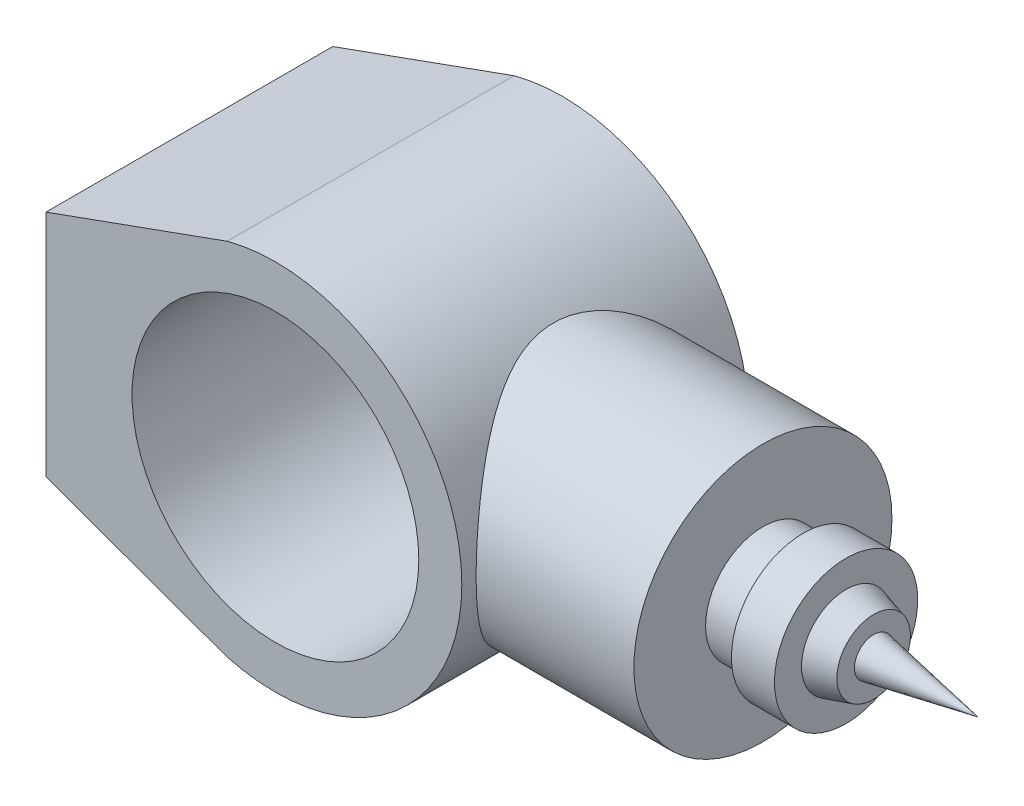
ISO-10303-21;
HEADER;
FILE_DESCRIPTION(('STEP AP214'),'2;1');
FILE_NAME('part.step','',(''),(''),'','','');
FILE_SCHEMA(('AUTOMOTIVE_DESIGN { 1 0 10303 214 1 1 1 1 }'));
ENDSEC;
DATA;
#1=APPLICATION_CONTEXT('core data for automotive mechanical design processes');
#2=APPLICATION_PROTOCOL_DEFINITION('international standard','automotive_design',2000,#1);
#3=PRODUCT_CONTEXT('',#1,'mechanical');
#4=PRODUCT('Part','Part','',(#3));
#5=PRODUCT_RELATED_PRODUCT_CATEGORY('part','',(#4));
#6=PRODUCT_DEFINITION_FORMATION('','',#4);
#7=PRODUCT_DEFINITION_CONTEXT('part definition',#1,'design');
#8=PRODUCT_DEFINITION('design','',#6,#7);
#9=PRODUCT_DEFINITION_SHAPE('','',#8);
#10=(LENGTH_UNIT() NAMED_UNIT(*) SI_UNIT(.MILLI.,.METRE.));
#11=(NAMED_UNIT(*) PLANE_ANGLE_UNIT() SI_UNIT($,.RADIAN.));
#12=(NAMED_UNIT(*) SI_UNIT($,.STERADIAN.) SOLID_ANGLE_UNIT());
#13=UNCERTAINTY_MEASURE_WITH_UNIT(LENGTH_MEASURE(1.E-05),#10,'distance_accuracy_value','');
#14=(GEOMETRIC_REPRESENTATION_CONTEXT(3) GLOBAL_UNCERTAINTY_ASSIGNED_CONTEXT((#13)) GLOBAL_UNIT_ASSIGNED_CONTEXT((#10,
#11,#12)) REPRESENTATION_CONTEXT('',''));
#15=CARTESIAN_POINT('',(0.,0.,0.));
#16=DIRECTION('',(0.,0.,1.));
#17=DIRECTION('',(1.,0.,0.));
#18=AXIS2_PLACEMENT_3D('',#15,#16,#17);
#19=CARTESIAN_POINT('',(0.,0.,50.));
#20=DIRECTION('',(0.,0.,1.));
#21=DIRECTION('',(1.,0.,0.));
#22=AXIS2_PLACEMENT_3D('',#19,#20,#21);
#23=PLANE('',#22);
#24=DIRECTION('',(-0.94071150861508,-0.339207690890317,0.));
#25=VECTOR('',#24,1.);
#26=CARTESIAN_POINT('',(-80.,40.,50.));
#27=LINE('',#26,#25);
#28=CARTESIAN_POINT('',(-16.7748419777573,62.7981263782708,50.));
#29=VERTEX_POINT('',#28);
#30=CARTESIAN_POINT('',(-80.,40.,50.));
#31=VERTEX_POINT('',#30);
#32=EDGE_CURVE('E183',#29,#31,#27,.T.);
#33=ORIENTED_EDGE('',*,*,#32,.T.);
#34=DIRECTION('',(0.,-1.,0.));
#35=VECTOR('',#34,1.);
#36=CARTESIAN_POINT('',(-80.,-40.,50.));
#37=LINE('',#36,#35);
#38=CARTESIAN_POINT('',(-80.,-40.,50.));
#39=VERTEX_POINT('',#38);
#40=EDGE_CURVE('E87',#31,#39,#37,.T.);
#41=ORIENTED_EDGE('',*,*,#40,.T.);
#42=DIRECTION('',(0.94071150861508,-0.339207690890317,0.));
#43=VECTOR('',#42,1.);
#44=CARTESIAN_POINT('',(-80.,-40.,50.));
#45=LINE('',#44,#43);
#46=CARTESIAN_POINT('',(-16.7748419777573,-62.7981263782708,50.));
#47=VERTEX_POINT('',#46);
#48=EDGE_CURVE('E182',#39,#47,#45,.T.);
#49=ORIENTED_EDGE('',*,*,#48,.T.);
#50=CARTESIAN_POINT('',(0.,0.,50.));
#51=DIRECTION('',(0.,0.,1.));
#52=DIRECTION('',(1.,0.,0.));
#53=AXIS2_PLACEMENT_3D('',#50,#51,#52);
#54=CIRCLE('',#53,65.);
#55=EDGE_CURVE('E57',#47,#29,#54,.T.);
#56=ORIENTED_EDGE('',*,*,#55,.T.);
#57=EDGE_LOOP('',(#33,#41,#49,#56));
#58=FACE_BOUND('',#57,.T.);
#59=CARTESIAN_POINT('',(0.,0.,50.));
#60=DIRECTION('',(0.,0.,1.));
#61=DIRECTION('',(1.,0.,0.));
#62=AXIS2_PLACEMENT_3D('',#59,#60,#61);
#63=CIRCLE('',#62,50.);
#64=CARTESIAN_POINT('',(50.,0.,50.));
#65=VERTEX_POINT('',#64);
#66=EDGE_CURVE('E193',#65,#65,#63,.T.);
#67=ORIENTED_EDGE('',*,*,#66,.F.);
#68=EDGE_LOOP('',(#67));
#69=FACE_BOUND('',#68,.T.);
#70=ADVANCED_FACE('F39',(#58,#69),#23,.T.);
#71=CARTESIAN_POINT('',(0.,0.,-50.));
#72=DIRECTION('',(0.,0.,1.));
#73=DIRECTION('',(1.,0.,0.));
#74=AXIS2_PLACEMENT_3D('',#71,#72,#73);
#75=PLANE('',#74);
#76=DIRECTION('',(-0.94071150861508,-0.339207690890317,0.));
#77=VECTOR('',#76,1.);
#78=CARTESIAN_POINT('',(-80.,40.,-50.));
#79=LINE('',#78,#77);
#80=CARTESIAN_POINT('',(-16.7748419777573,62.7981263782708,-50.));
#81=VERTEX_POINT('',#80);
#82=CARTESIAN_POINT('',(-80.,40.,-50.));
#83=VERTEX_POINT('',#82);
#84=EDGE_CURVE('E176',#81,#83,#79,.T.);
#85=ORIENTED_EDGE('',*,*,#84,.F.);
#86=CARTESIAN_POINT('',(0.,0.,-50.));
#87=DIRECTION('',(0.,0.,1.));
#88=DIRECTION('',(1.,0.,0.));
#89=AXIS2_PLACEMENT_3D('',#86,#87,#88);
#90=CIRCLE('',#89,65.);
#91=CARTESIAN_POINT('',(-16.7748419777573,-62.7981263782708,-50.));
#92=VERTEX_POINT('',#91);
#93=EDGE_CURVE('E78',#92,#81,#90,.T.);
#94=ORIENTED_EDGE('',*,*,#93,.F.);
#95=DIRECTION('',(0.94071150861508,-0.339207690890317,0.));
#96=VECTOR('',#95,1.);
#97=CARTESIAN_POINT('',(-80.,-40.,-50.));
#98=LINE('',#97,#96);
#99=CARTESIAN_POINT('',(-80.,-40.,-50.));
#100=VERTEX_POINT('',#99);
#101=EDGE_CURVE('E74',#100,#92,#98,.T.);
#102=ORIENTED_EDGE('',*,*,#101,.F.);
#103=DIRECTION('',(0.,-1.,0.));
#104=VECTOR('',#103,1.);
#105=CARTESIAN_POINT('',(-80.,-40.,-50.));
#106=LINE('',#105,#104);
#107=EDGE_CURVE('E171',#83,#100,#106,.T.);
#108=ORIENTED_EDGE('',*,*,#107,.F.);
#109=EDGE_LOOP('',(#85,#94,#102,#108));
#110=FACE_BOUND('',#109,.T.);
#111=CARTESIAN_POINT('',(0.,0.,-50.));
#112=DIRECTION('',(0.,0.,1.));
#113=DIRECTION('',(1.,0.,0.));
#114=AXIS2_PLACEMENT_3D('',#111,#112,#113);
#115=CIRCLE('',#114,50.);
#116=CARTESIAN_POINT('',(50.,0.,-50.));
#117=VERTEX_POINT('',#116);
#118=EDGE_CURVE('E197',#117,#117,#115,.T.);
#119=ORIENTED_EDGE('',*,*,#118,.T.);
#120=EDGE_LOOP('',(#119));
#121=FACE_BOUND('',#120,.T.);
#122=ADVANCED_FACE('F152',(#110,#121),#75,.F.);
#123=CARTESIAN_POINT('',(-80.,40.,50.));
#124=DIRECTION('',(0.339207690890317,-0.94071150861508,0.));
#125=DIRECTION('',(0.94071150861508,0.339207690890317,0.));
#126=AXIS2_PLACEMENT_3D('',#123,#124,#125);
#127=PLANE('',#126);
#128=ORIENTED_EDGE('',*,*,#84,.T.);
#129=DIRECTION('',(0.,0.,-1.));
#130=VECTOR('',#129,1.);
#131=CARTESIAN_POINT('',(-80.,40.,50.));
#132=LINE('',#131,#130);
#133=EDGE_CURVE('E11',#31,#83,#132,.T.);
#134=ORIENTED_EDGE('',*,*,#133,.F.);
#135=ORIENTED_EDGE('',*,*,#32,.F.);
#136=DIRECTION('',(0.,0.,-1.));
#137=VECTOR('',#136,1.);
#138=CARTESIAN_POINT('',(-16.7748419777573,62.7981263782708,50.));
#139=LINE('',#138,#137);
#140=EDGE_CURVE('E186',#29,#81,#139,.T.);
#141=ORIENTED_EDGE('',*,*,#140,.T.);
#142=EDGE_LOOP('',(#128,#134,#135,#141));
#143=FACE_BOUND('',#142,.T.);
#144=ADVANCED_FACE('F41',(#143),#127,.F.);
#145=CARTESIAN_POINT('',(-80.,-40.,50.));
#146=DIRECTION('',(1.,0.,0.));
#147=DIRECTION('',(0.,0.,-1.));
#148=AXIS2_PLACEMENT_3D('',#145,#146,#147);
#149=PLANE('',#148);
#150=ORIENTED_EDGE('',*,*,#107,.T.);
#151=DIRECTION('',(0.,0.,-1.));
#152=VECTOR('',#151,1.);
#153=CARTESIAN_POINT('',(-80.,-40.,50.));
#154=LINE('',#153,#152);
#155=EDGE_CURVE('E48',#39,#100,#154,.T.);
#156=ORIENTED_EDGE('',*,*,#155,.F.);
#157=ORIENTED_EDGE('',*,*,#40,.F.);
#158=ORIENTED_EDGE('',*,*,#133,.T.);
#159=EDGE_LOOP('',(#150,#156,#157,#158));
#160=FACE_BOUND('',#159,.T.);
#161=ADVANCED_FACE('F169',(#160),#149,.F.);
#162=CARTESIAN_POINT('',(-80.,-40.,50.));
#163=DIRECTION('',(0.339207690890317,0.940711508615079,0.));
#164=DIRECTION('',(-0.94071150861508,0.339207690890317,0.));
#165=AXIS2_PLACEMENT_3D('',#162,#163,#164);
#166=PLANE('',#165);
#167=ORIENTED_EDGE('',*,*,#101,.T.);
#168=DIRECTION('',(0.,0.,-1.));
#169=VECTOR('',#168,1.);
#170=CARTESIAN_POINT('',(-16.7748419777573,-62.7981263782708,50.));
#171=LINE('',#170,#169);
#172=EDGE_CURVE('E185',#47,#92,#171,.T.);
#173=ORIENTED_EDGE('',*,*,#172,.F.);
#174=ORIENTED_EDGE('',*,*,#48,.F.);
#175=ORIENTED_EDGE('',*,*,#155,.T.);
#176=EDGE_LOOP('',(#167,#173,#174,#175));
#177=FACE_BOUND('',#176,.T.);
#178=ADVANCED_FACE('F164',(#177),#166,.F.);
#179=CARTESIAN_POINT('',(0.,0.,50.));
#180=DIRECTION('',(0.,0.,-1.));
#181=DIRECTION('',(-1.,0.,0.));
#182=AXIS2_PLACEMENT_3D('',#179,#180,#181);
#183=CYLINDRICAL_SURFACE('',#182,65.);
#184=CARTESIAN_POINT('',(65.,0.,-45.));
#185=CARTESIAN_POINT('',(65.0000011696057,1.12147330120565,-45.0000012025283));
#186=CARTESIAN_POINT('',(64.9709159765212,2.24292945230778,-44.9580201602482));
#187=CARTESIAN_POINT('',(64.8553068641383,4.47658414079082,-44.790785609369));
#188=CARTESIAN_POINT('',(64.7687842573088,5.58878288911931,-44.6655340035371));
#189=CARTESIAN_POINT('',(64.5403785763001,7.79555151848628,-44.3336771879691));
#190=CARTESIAN_POINT('',(64.3984760503456,8.89011506447751,-44.1270433931238));
#191=CARTESIAN_POINT('',(64.0626457436966,11.0533096019768,-43.6354760134034));
#192=CARTESIAN_POINT('',(63.8687169569864,12.1219400915896,-43.3505409144375));
#193=CARTESIAN_POINT('',(63.4342222744662,14.2212125160505,-42.7078017297046));
#194=CARTESIAN_POINT('',(63.1938918545645,15.2520162370063,-42.3503651251477));
#195=CARTESIAN_POINT('',(62.6709259446924,17.2756280115286,-41.5659763086892));
#196=CARTESIAN_POINT('',(62.3882907364915,18.268436318107,-41.1390245597888));
#197=CARTESIAN_POINT('',(61.786108553932,20.2116697228795,-40.2199419970838));
#198=CARTESIAN_POINT('',(61.4665619062631,21.1620951960855,-39.7278117601444));
#199=CARTESIAN_POINT('',(60.7962171584065,23.0172309124314,-38.6825647509799));
#200=CARTESIAN_POINT('',(60.4454175300334,23.9219389167185,-38.1294449962195));
#201=CARTESIAN_POINT('',(59.6865648974474,25.7601880140228,-36.9151737617935));
#202=CARTESIAN_POINT('',(59.27618815402,26.6893215363404,-36.2488040005491));
#203=CARTESIAN_POINT('',(58.4330275057249,28.4880338622967,-34.8529502059224));
#204=CARTESIAN_POINT('',(58.0002425478181,29.3576098626539,-34.1234632053608));
#205=CARTESIAN_POINT('',(57.1195111836477,31.0364486388513,-32.6040251352403));
#206=CARTESIAN_POINT('',(56.6715447181891,31.8456267033451,-31.8139921794123));
#207=CARTESIAN_POINT('',(55.7691986061138,33.4006700551814,-30.1773036556993));
#208=CARTESIAN_POINT('',(55.3148185876119,34.1465316534289,-29.3306447936721));
#209=CARTESIAN_POINT('',(54.3303114345595,35.6959084068904,-27.4326466159468));
#210=CARTESIAN_POINT('',(53.8005937511269,36.4872853280241,-26.3711450656527));
#211=CARTESIAN_POINT('',(52.7593327891933,37.9773509509911,-24.17604025639));
#212=CARTESIAN_POINT('',(52.2477941160227,38.6760162868262,-23.0424189272517));
#213=CARTESIAN_POINT('',(51.2608149265043,39.9749077721744,-20.7072341856928));
#214=CARTESIAN_POINT('',(50.7853275075273,40.5752630453964,-19.5057627267967));
#215=CARTESIAN_POINT('',(49.8892399163793,41.6721166930025,-17.036931864064));
#216=CARTESIAN_POINT('',(49.4686114171658,42.1686687478853,-15.7696069409943));
#217=CARTESIAN_POINT('',(48.8208029416879,42.9149535309565,-13.5723996352816));
#218=CARTESIAN_POINT('',(48.5738420263557,43.1936925213245,-12.6581208440976));
#219=CARTESIAN_POINT('',(48.1238801744123,43.6944569649788,-10.8035389223551));
#220=CARTESIAN_POINT('',(47.9208721021929,43.9164916250901,-9.86324004407419));
#221=CARTESIAN_POINT('',(47.5660754926548,44.3005296261305,-7.96250438663409));
#222=CARTESIAN_POINT('',(47.4142038087044,44.4626304606427,-7.00210302149487));
#223=CARTESIAN_POINT('',(47.1671263845177,44.7246555122386,-5.06554052628518));
#224=CARTESIAN_POINT('',(47.0719206259529,44.824579749433,-4.08937940131224));
#225=CARTESIAN_POINT('',(46.9418899090943,44.9607388198673,-2.1232364847967));
#226=CARTESIAN_POINT('',(46.9073939345417,44.9966266570423,-1.13320851844658));
#227=CARTESIAN_POINT('',(46.9013571135476,45.0029190462422,0.847248377093852));
#228=CARTESIAN_POINT('',(46.9298161498631,44.9733237202183,1.837677305534));
#229=CARTESIAN_POINT('',(47.0484302849821,44.8492190899201,3.81128752429081));
#230=CARTESIAN_POINT('',(47.13862305521,44.7546701492421,4.79446401850661));
#231=CARTESIAN_POINT('',(47.3768313176079,44.5024241630868,6.74551496467455));
#232=CARTESIAN_POINT('',(47.5248480621437,44.3447257499009,7.71338908473168));
#233=CARTESIAN_POINT('',(47.8621764271841,43.9803320764262,9.56919366964684));
#234=CARTESIAN_POINT('',(48.0484149088864,43.7772163066585,10.4583970625519));
#235=CARTESIAN_POINT('',(48.4609441046406,43.32010640119,12.2144143492181));
#236=CARTESIAN_POINT('',(48.6872496045115,43.0660934784815,13.0812198417583));
#237=CARTESIAN_POINT('',(49.1738509640383,42.5096331932465,14.7898225666927));
#238=CARTESIAN_POINT('',(49.4341648638834,42.2071601049958,15.6316062329481));
#239=CARTESIAN_POINT('',(49.9825182796335,41.5563350032134,17.2876417419013));
#240=CARTESIAN_POINT('',(50.2705534011697,41.2079902580444,18.1018979206949));
#241=CARTESIAN_POINT('',(51.0225431471345,40.2767822129268,20.1137766396802));
#242=CARTESIAN_POINT('',(51.5007434523328,39.6654891440572,21.2930273345177));
#243=CARTESIAN_POINT('',(52.4891158781477,38.348029920852,23.5833678403921));
#244=CARTESIAN_POINT('',(52.9993005340589,37.6418264436726,24.6944305853524));
#245=CARTESIAN_POINT('',(54.0361557973494,36.1376496350166,26.8476775780095));
#246=CARTESIAN_POINT('',(54.5628535785461,35.3395185623559,27.8897384505711));
#247=CARTESIAN_POINT('',(55.6171804467178,33.6558443419671,29.8998791095632));
#248=CARTESIAN_POINT('',(56.1448094104418,32.7703120184234,30.8679680307498));
#249=CARTESIAN_POINT('',(57.1932449701135,30.9045304086319,32.7363921475659));
#250=CARTESIAN_POINT('',(57.7139191350983,29.9233731295192,33.6358963165067));
#251=CARTESIAN_POINT('',(58.7296419536465,27.8771206485979,35.350355349792));
#252=CARTESIAN_POINT('',(59.2246882700661,26.8120178135979,36.1653025097018));
#253=CARTESIAN_POINT('',(60.1756566955639,24.6035209522421,37.7024332048813));
#254=CARTESIAN_POINT('',(60.6316475651595,23.4602711709794,38.4247809320632));
#255=CARTESIAN_POINT('',(61.4931891608211,21.0989507187335,39.7703323765769));
#256=CARTESIAN_POINT('',(61.898755017873,19.8809026570889,40.3935658507715));
#257=CARTESIAN_POINT('',(62.5646802947783,17.6549035875762,41.4059204565395));
#258=CARTESIAN_POINT('',(62.8372982548467,16.6602403417733,41.8163120535009));
#259=CARTESIAN_POINT('',(63.3397164077328,14.6345031625144,42.5675669112335));
#260=CARTESIAN_POINT('',(63.569522535998,13.603434299959,42.9084398107234));
#261=CARTESIAN_POINT('',(63.9815049902596,11.5110112910016,43.5164676119118));
#262=CARTESIAN_POINT('',(64.1637052650743,10.4496726714621,43.7836595836378));
#263=CARTESIAN_POINT('',(64.476639865795,8.30296993183371,44.2409869387356));
#264=CARTESIAN_POINT('',(64.6073730982257,7.21760530180254,44.431120684921));
#265=CARTESIAN_POINT('',(64.8147345736682,5.02649787175023,44.7321113931983));
#266=CARTESIAN_POINT('',(64.8911534961694,3.92069290489763,44.8426616714377));
#267=CARTESIAN_POINT('',(64.9872183357685,1.70145350776208,44.981563734156));
#268=CARTESIAN_POINT('',(65.0068642771874,0.588019080747696,45.0099155538474));
#269=CARTESIAN_POINT('',(64.9889001241945,-1.63741781931566,44.9839662509349));
#270=CARTESIAN_POINT('',(64.9512898349751,-2.74942028747967,44.929664847113));
#271=CARTESIAN_POINT('',(64.819734418053,-4.96298947367603,44.7392747901952));
#272=CARTESIAN_POINT('',(64.7257910494465,-6.06455651648127,44.6031886909653));
#273=CARTESIAN_POINT('',(64.491175703309,-8.18254449212149,44.2620157992034));
#274=CARTESIAN_POINT('',(64.3536808680178,-9.20007959997774,44.0616107864454));
#275=CARTESIAN_POINT('',(64.0337856060908,-11.2121337136589,43.5930613516679));
#276=CARTESIAN_POINT('',(63.8513873855499,-12.2066538475799,43.3249202574929));
#277=CARTESIAN_POINT('',(63.4451725249075,-14.1673074608523,42.7239854011605));
#278=CARTESIAN_POINT('',(63.2213525684632,-15.1334386601223,42.3911864622047));
#279=CARTESIAN_POINT('',(62.736336352677,-17.0327019487273,41.6643868113868));
#280=CARTESIAN_POINT('',(62.4751380044848,-17.965832190203,41.2703826790343));
#281=CARTESIAN_POINT('',(61.8990085085122,-19.8637431772395,40.3931275129008));
#282=CARTESIAN_POINT('',(61.5815209528501,-20.8256806929253,39.9054081529014));
#283=CARTESIAN_POINT('',(60.9142086391395,-22.7035764997345,38.8677076181211));
#284=CARTESIAN_POINT('',(60.5643826081083,-23.6195329786528,38.3177239921568));
#285=CARTESIAN_POINT('',(59.8381347129401,-25.4032558353403,37.1592008079418));
#286=CARTESIAN_POINT('',(59.4616987975441,-26.270996314329,36.5506302507532));
#287=CARTESIAN_POINT('',(58.6884577670336,-27.9557544991496,35.2787474176625));
#288=CARTESIAN_POINT('',(58.2916515549571,-28.7727694681138,34.6154321925309));
#289=CARTESIAN_POINT('',(57.4151711853793,-30.4889708749912,33.1199200847161));
#290=CARTESIAN_POINT('',(56.9328754552547,-31.3785212006928,32.2781812569548));
#291=CARTESIAN_POINT('',(55.9590893109094,-33.0839042215169,30.5278352445589));
#292=CARTESIAN_POINT('',(55.4675975421249,-33.8997259516808,29.6192181500899));
#293=CARTESIAN_POINT('',(54.4860350387397,-35.45586994741,27.7375714933993));
#294=CARTESIAN_POINT('',(53.9959654596117,-36.1961418986443,26.7644997080007));
#295=CARTESIAN_POINT('',(53.0294834997435,-37.5978502361011,24.7568233036382));
#296=CARTESIAN_POINT('',(52.553069328415,-38.2592969946585,23.7222268074148));
#297=CARTESIAN_POINT('',(51.679941347726,-39.4291013564639,21.7149007388747));
#298=CARTESIAN_POINT('',(51.2803372484816,-39.9463152685162,20.7485884228094));
#299=CARTESIAN_POINT('',(50.5123974548912,-40.9130636661729,18.7705314851885));
#300=CARTESIAN_POINT('',(50.1440619804653,-41.3625976757848,17.7587865441704));
#301=CARTESIAN_POINT('',(49.4504928922364,-42.1893301292689,15.693797265063));
#302=CARTESIAN_POINT('',(49.1251906412473,-42.566644202947,14.6406225749502));
#303=CARTESIAN_POINT('',(48.5290098021012,-43.2451098617227,12.4950157035289));
#304=CARTESIAN_POINT('',(48.2581179989952,-43.5462799449171,11.4025931307277));
#305=CARTESIAN_POINT('',(47.8271610412375,-44.0186874861181,9.3921629994351));
#306=CARTESIAN_POINT('',(47.6558419905218,-44.2036946073207,8.47979353570419));
#307=CARTESIAN_POINT('',(47.3627606953031,-44.517583244497,6.63757582668245));
#308=CARTESIAN_POINT('',(47.2409923142224,-44.6464717105955,5.70772976070373));
#309=CARTESIAN_POINT('',(47.05166615705,-44.8459556683364,3.83718735816971));
#310=CARTESIAN_POINT('',(46.9840561376509,-44.9166073394187,2.89650236820514));
#311=CARTESIAN_POINT('',(46.9055698265682,-44.9985645522097,1.01014116515035));
#312=CARTESIAN_POINT('',(46.894694331428,-45.0098692606967,0.0644648821697862));
#313=CARTESIAN_POINT('',(46.9301408777119,-44.972908524549,-1.82506201386804));
#314=CARTESIAN_POINT('',(46.9764888551696,-44.9246160680299,-2.76891160474201));
#315=CARTESIAN_POINT('',(47.1245232303033,-44.7693052695385,-4.64731891289862));
#316=CARTESIAN_POINT('',(47.226209296244,-44.6622872796082,-5.58187668584874));
#317=CARTESIAN_POINT('',(47.4811423262629,-44.3911660407895,-7.43666598606561));
#318=CARTESIAN_POINT('',(47.634452919394,-44.2269923369625,-8.35687836049678));
#319=CARTESIAN_POINT('',(47.9871889035597,-43.8440109221367,-10.1768310643423));
#320=CARTESIAN_POINT('',(48.1866204648689,-43.6251959006593,-11.0765686368372));
#321=CARTESIAN_POINT('',(48.6908782922366,-43.0625185245671,-13.116726178063));
#322=CARTESIAN_POINT('',(49.0093972350599,-42.7008255731353,-14.2488681052183));
#323=CARTESIAN_POINT('',(49.699554494161,-41.8955268796886,-16.4668795226373));
#324=CARTESIAN_POINT('',(50.0712093704162,-41.4518955887103,-17.5527344499461));
#325=CARTESIAN_POINT('',(50.8544123719762,-40.4872212981013,-19.6760329984318));
#326=CARTESIAN_POINT('',(51.2660067549033,-39.9660881554129,-20.7134183727638));
#327=CARTESIAN_POINT('',(52.116211879306,-38.8508952329155,-22.7363587217865));
#328=CARTESIAN_POINT('',(52.5548209260535,-38.2568400254561,-23.7219169406072));
#329=CARTESIAN_POINT('',(53.4579357785502,-36.9847423381263,-25.6613286822633));
#330=CARTESIAN_POINT('',(53.9228021101371,-36.3051118639051,-26.6139712103077));
#331=CARTESIAN_POINT('',(54.8583333343946,-34.8753950985048,-28.4617532840731));
#332=CARTESIAN_POINT('',(55.3289982185488,-34.1253089107936,-29.3568929142368));
#333=CARTESIAN_POINT('',(56.2664339133503,-32.5564691651912,-31.0876310121466));
#334=CARTESIAN_POINT('',(56.7332035093429,-31.7376950080829,-31.923211478402));
#335=CARTESIAN_POINT('',(57.6535165855435,-30.033481652025,-33.5315189390535));
#336=CARTESIAN_POINT('',(58.1070588196762,-29.1480362003111,-34.3042400240121));
#337=CARTESIAN_POINT('',(59.0635284336244,-27.1643113596245,-35.9022819462667));
#338=CARTESIAN_POINT('',(59.5626106290919,-26.0547472869609,-36.7159606163356));
#339=CARTESIAN_POINT('',(60.5176757229357,-23.7521280348398,-38.2458641369291));
#340=CARTESIAN_POINT('',(60.9736519283074,-22.5590599397198,-38.962073861155));
#341=CARTESIAN_POINT('',(61.6149926579414,-20.7127348127311,-39.9558623322098));
#342=CARTESIAN_POINT('',(61.8215919655179,-20.088110583999,-40.2735888165198));
#343=CARTESIAN_POINT('',(62.2191547005856,-18.8206694867556,-40.8812436548858));
#344=CARTESIAN_POINT('',(62.4101203779565,-18.1778552539997,-41.1711760099034));
#345=CARTESIAN_POINT('',(62.7748527233683,-16.875283117665,-41.7219931318356));
#346=CARTESIAN_POINT('',(62.9486230408552,-16.2155288469421,-41.9828840638124));
#347=CARTESIAN_POINT('',(63.2775356475737,-14.8804011558233,-42.4744610119283));
#348=CARTESIAN_POINT('',(63.432679284421,-14.2050288695917,-42.7051492133046));
#349=CARTESIAN_POINT('',(63.8070721968101,-12.4447010544915,-43.25974494481));
#350=CARTESIAN_POINT('',(64.0114184468014,-11.3490405228654,-43.5602757498286));
#351=CARTESIAN_POINT('',(64.3654191982087,-9.12991345978806,-44.078827644396));
#352=CARTESIAN_POINT('',(64.5150820049425,-8.00645117856259,-44.2968612637911));
#353=CARTESIAN_POINT('',(64.7559993187061,-5.74082253729113,-44.6470112993716));
#354=CARTESIAN_POINT('',(64.847297757104,-4.59867091062173,-44.7791923387443));
#355=CARTESIAN_POINT('',(64.9692976296881,-2.30434018473195,-44.9556862638234));
#356=CARTESIAN_POINT('',(64.9999987983895,-1.15216104160189,-44.999998764566));
#357=CARTESIAN_POINT('',(65.,0.,-45.));
#358=B_SPLINE_CURVE_WITH_KNOTS('',3,(#184,#185,#186,#187,#188,#189,#190,#191,#192,#193,#194,
#195,#196,#197,#198,#199,#200,#201,#202,#203,#204,#205,#206,#207,#208,#209,#210,#211,#212,#213,
#214,#215,#216,#217,#218,#219,#220,#221,#222,#223,#224,#225,#226,#227,#228,#229,#230,#231,#232,
#233,#234,#235,#236,#237,#238,#239,#240,#241,#242,#243,#244,#245,#246,#247,#248,#249,#250,#251,
#252,#253,#254,#255,#256,#257,#258,#259,#260,#261,#262,#263,#264,#265,#266,#267,#268,#269,#270,
#271,#272,#273,#274,#275,#276,#277,#278,#279,#280,#281,#282,#283,#284,#285,#286,#287,#288,#289,
#290,#291,#292,#293,#294,#295,#296,#297,#298,#299,#300,#301,#302,#303,#304,#305,#306,#307,#308,
#309,#310,#311,#312,#313,#314,#315,#316,#317,#318,#319,#320,#321,#322,#323,#324,#325,#326,#327,
#328,#329,#330,#331,#332,#333,#334,#335,#336,#337,#338,#339,#340,#341,#342,#343,#344,#345,#346,
#347,#348,#349,#350,#351,#352,#353,#354,#355,#356,#357),.UNSPECIFIED.,.T.,.F.,(4,2,2,2,2,2,2,2,
2,2,2,2,2,2,2,2,2,2,2,2,2,2,2,2,2,2,2,2,2,2,2,2,2,2,2,2,2,2,2,2,2,2,2,2,2,2,2,2,2,2,2,2,2,2,2,2,
2,2,2,2,2,2,2,2,2,2,2,2,2,2,2,2,2,2,2,2,2,2,2,2,2,2,2,2,2,2,4),(0.,3.36323892794144,
6.72640100710137,10.0907454360665,13.4551549250109,16.8029195613731,20.1506619010729,
23.4983746134034,26.8462511096753,30.4871649037346,34.1282499524345,37.7743494260164,
41.4206611917409,45.6939383064405,49.9682903731881,54.2369825353392,58.5034617073671,
61.4625138492405,64.4210852373372,67.3748225577202,70.3285589227263,73.2982527376573,
76.2679410220407,79.2394430998938,82.2110095388412,85.0011411726389,87.7923045951578,
90.584954683776,93.3771628083065,97.6064034875675,101.837312178738,106.075592113262,
110.313347816192,114.596218662803,118.879479402292,123.155037051935,127.429308626693,
130.755998382163,134.082226580387,137.406778235214,140.731400520075,144.068767009318,
147.406132068879,150.743508483461,154.080780688207,157.215791533369,160.350648386749,
163.485756334407,166.621039552604,169.990545063149,173.360183268584,176.73161428665,
180.103227050672,184.047902440152,187.993163521895,191.94103513809,195.888386692538,
199.385185586645,202.88200907258,206.373186157811,209.863514294626,212.700365177753,
215.536864625513,218.370624567028,221.204424293963,224.039508887241,226.874576485218,
229.713151272815,232.55210603787,236.23803941247,239.925124033801,243.616531168718,
247.307706963636,251.081871120678,254.856029735252,258.631324277359,262.406973327354,
266.792058434818,271.177823293658,273.368885604935,275.55963203795,277.749912517597,
279.940034437727,283.398420446896,286.856280978073,290.31153567335,293.766805506531),.UNSPECIFIED.);
#359=CARTESIAN_POINT('',(65.,0.,-45.));
#360=VERTEX_POINT('',#359);
#361=EDGE_CURVE('E118',#360,#360,#358,.T.);
#362=ORIENTED_EDGE('',*,*,#361,.F.);
#363=EDGE_LOOP('',(#362));
#364=FACE_BOUND('',#363,.T.);
#365=ORIENTED_EDGE('',*,*,#93,.T.);
#366=ORIENTED_EDGE('',*,*,#140,.F.);
#367=ORIENTED_EDGE('',*,*,#55,.F.);
#368=ORIENTED_EDGE('',*,*,#172,.T.);
#369=EDGE_LOOP('',(#365,#366,#367,#368));
#370=FACE_BOUND('',#369,.T.);
#371=ADVANCED_FACE('F151',(#364,#370),#183,.T.);
#372=CARTESIAN_POINT('',(0.,0.,50.));
#373=DIRECTION('',(0.,0.,-1.));
#374=DIRECTION('',(-1.,0.,0.));
#375=AXIS2_PLACEMENT_3D('',#372,#373,#374);
#376=CYLINDRICAL_SURFACE('',#375,50.);
#377=ORIENTED_EDGE('',*,*,#66,.T.);
#378=EDGE_LOOP('',(#377));
#379=FACE_BOUND('',#378,.T.);
#380=ORIENTED_EDGE('',*,*,#118,.F.);
#381=EDGE_LOOP('',(#380));
#382=FACE_BOUND('',#381,.T.);
#383=ADVANCED_FACE('F143',(#379,#382),#376,.F.);
#384=CARTESIAN_POINT('',(-80.002,0.,0.));
#385=DIRECTION('',(1.,0.,0.));
#386=DIRECTION('',(0.,0.,-1.));
#387=AXIS2_PLACEMENT_3D('',#384,#385,#386);
#388=CYLINDRICAL_SURFACE('',#387,45.);
#389=CARTESIAN_POINT('',(120.,0.,0.));
#390=DIRECTION('',(1.,0.,0.));
#391=DIRECTION('',(0.,0.,-1.));
#392=AXIS2_PLACEMENT_3D('',#389,#390,#391);
#393=CIRCLE('',#392,45.);
#394=CARTESIAN_POINT('',(120.,0.,-45.));
#395=VERTEX_POINT('',#394);
#396=EDGE_CURVE('E126',#395,#395,#393,.T.);
#397=ORIENTED_EDGE('',*,*,#396,.F.);
#398=EDGE_LOOP('',(#397));
#399=FACE_BOUND('',#398,.T.);
#400=ORIENTED_EDGE('',*,*,#361,.T.);
#401=EDGE_LOOP('',(#400));
#402=FACE_BOUND('',#401,.T.);
#403=ADVANCED_FACE('F128',(#399,#402),#388,.T.);
#404=CARTESIAN_POINT('',(120.,0.,0.));
#405=DIRECTION('',(1.,0.,0.));
#406=DIRECTION('',(0.,0.,-1.));
#407=AXIS2_PLACEMENT_3D('',#404,#405,#406);
#408=PLANE('',#407);
#409=CARTESIAN_POINT('',(120.,0.,0.));
#410=DIRECTION('',(-1.,0.,0.));
#411=DIRECTION('',(0.,0.,1.));
#412=AXIS2_PLACEMENT_3D('',#409,#410,#411);
#413=CIRCLE('',#412,20.);
#414=CARTESIAN_POINT('',(120.,0.,20.));
#415=VERTEX_POINT('',#414);
#416=EDGE_CURVE('E120',#415,#415,#413,.T.);
#417=ORIENTED_EDGE('',*,*,#416,.T.);
#418=EDGE_LOOP('',(#417));
#419=FACE_BOUND('',#418,.T.);
#420=ORIENTED_EDGE('',*,*,#396,.T.);
#421=EDGE_LOOP('',(#420));
#422=FACE_BOUND('',#421,.T.);
#423=ADVANCED_FACE('F139',(#419,#422),#408,.T.);
#424=CARTESIAN_POINT('',(0.,0.,0.));
#425=DIRECTION('',(-1.,0.,0.));
#426=DIRECTION('',(0.,0.,1.));
#427=AXIS2_PLACEMENT_3D('',#424,#425,#426);
#428=CYLINDRICAL_SURFACE('',#427,20.);
#429=CARTESIAN_POINT('',(134.,0.,0.));
#430=DIRECTION('',(-1.,0.,0.));
#431=DIRECTION('',(0.,0.,1.));
#432=AXIS2_PLACEMENT_3D('',#429,#430,#431);
#433=CIRCLE('',#432,20.);
#434=CARTESIAN_POINT('',(134.,0.,20.));
#435=VERTEX_POINT('',#434);
#436=EDGE_CURVE('E111',#435,#435,#433,.T.);
#437=ORIENTED_EDGE('',*,*,#436,.T.);
#438=EDGE_LOOP('',(#437));
#439=FACE_BOUND('',#438,.T.);
#440=ORIENTED_EDGE('',*,*,#416,.F.);
#441=EDGE_LOOP('',(#440));
#442=FACE_BOUND('',#441,.T.);
#443=ADVANCED_FACE('F137',(#439,#442),#428,.T.);
#444=CARTESIAN_POINT('',(134.,-20.,0.));
#445=DIRECTION('',(-1.,0.,0.));
#446=DIRECTION('',(0.,0.,1.));
#447=AXIS2_PLACEMENT_3D('',#444,#445,#446);
#448=PLANE('',#447);
#449=CARTESIAN_POINT('',(134.,0.,0.));
#450=DIRECTION('',(-1.,0.,0.));
#451=DIRECTION('',(0.,0.,1.));
#452=AXIS2_PLACEMENT_3D('',#449,#450,#451);
#453=CIRCLE('',#452,25.);
#454=CARTESIAN_POINT('',(134.,0.,25.));
#455=VERTEX_POINT('',#454);
#456=EDGE_CURVE('E112',#455,#455,#453,.T.);
#457=ORIENTED_EDGE('',*,*,#456,.T.);
#458=EDGE_LOOP('',(#457));
#459=FACE_BOUND('',#458,.T.);
#460=ORIENTED_EDGE('',*,*,#436,.F.);
#461=EDGE_LOOP('',(#460));
#462=FACE_BOUND('',#461,.T.);
#463=ADVANCED_FACE('F148',(#459,#462),#448,.T.);
#464=CARTESIAN_POINT('',(0.,0.,0.));
#465=DIRECTION('',(-1.,0.,0.));
#466=DIRECTION('',(0.,0.,1.));
#467=AXIS2_PLACEMENT_3D('',#464,#465,#466);
#468=CYLINDRICAL_SURFACE('',#467,25.);
#469=CARTESIAN_POINT('',(149.,0.,0.));
#470=DIRECTION('',(-1.,0.,0.));
#471=DIRECTION('',(0.,0.,1.));
#472=AXIS2_PLACEMENT_3D('',#469,#470,#471);
#473=CIRCLE('',#472,25.);
#474=CARTESIAN_POINT('',(149.,0.,25.));
#475=VERTEX_POINT('',#474);
#476=EDGE_CURVE('E107',#475,#475,#473,.T.);
#477=ORIENTED_EDGE('',*,*,#476,.T.);
#478=EDGE_LOOP('',(#477));
#479=FACE_BOUND('',#478,.T.);
#480=ORIENTED_EDGE('',*,*,#456,.F.);
#481=EDGE_LOOP('',(#480));
#482=FACE_BOUND('',#481,.T.);
#483=ADVANCED_FACE('F265',(#479,#482),#468,.T.);
#484=CARTESIAN_POINT('',(149.,-25.,0.));
#485=DIRECTION('',(1.,0.,0.));
#486=DIRECTION('',(0.,0.,-1.));
#487=AXIS2_PLACEMENT_3D('',#484,#485,#486);
#488=PLANE('',#487);
#489=CARTESIAN_POINT('',(149.,0.,0.));
#490=DIRECTION('',(-1.,0.,0.));
#491=DIRECTION('',(0.,0.,1.));
#492=AXIS2_PLACEMENT_3D('',#489,#490,#491);
#493=CIRCLE('',#492,15.5558203264625);
#494=CARTESIAN_POINT('',(149.,0.,15.5558203264625));
#495=VERTEX_POINT('',#494);
#496=EDGE_CURVE('E103',#495,#495,#493,.T.);
#497=ORIENTED_EDGE('',*,*,#496,.T.);
#498=EDGE_LOOP('',(#497));
#499=FACE_BOUND('',#498,.T.);
#500=ORIENTED_EDGE('',*,*,#476,.F.);
#501=EDGE_LOOP('',(#500));
#502=FACE_BOUND('',#501,.T.);
#503=ADVANCED_FACE('F269',(#499,#502),#488,.T.);
#504=CARTESIAN_POINT('',(149.,0.,0.));
#505=DIRECTION('',(-1.,0.,0.));
#506=DIRECTION('',(0.,0.,1.));
#507=AXIS2_PLACEMENT_3D('',#504,#505,#506);
#508=CONICAL_SURFACE('',#507,15.5558203264625,0.277100822970286);
#509=CARTESIAN_POINT('',(158.618526021948,0.,0.));
#510=DIRECTION('',(-1.,0.,0.));
#511=DIRECTION('',(0.,0.,1.));
#512=AXIS2_PLACEMENT_3D('',#509,#510,#511);
#513=CIRCLE('',#512,12.820138114452);
#514=CARTESIAN_POINT('',(158.618526021948,0.,12.820138114452));
#515=VERTEX_POINT('',#514);
#516=EDGE_CURVE('E99',#515,#515,#513,.T.);
#517=ORIENTED_EDGE('',*,*,#516,.T.);
#518=EDGE_LOOP('',(#517));
#519=FACE_BOUND('',#518,.T.);
#520=ORIENTED_EDGE('',*,*,#496,.F.);
#521=EDGE_LOOP('',(#520));
#522=FACE_BOUND('',#521,.T.);
#523=ADVANCED_FACE('F276',(#519,#522),#508,.T.);
#524=CARTESIAN_POINT('',(158.618526021948,-12.820138114452,0.));
#525=DIRECTION('',(1.,0.,0.));
#526=DIRECTION('',(0.,0.,-1.));
#527=AXIS2_PLACEMENT_3D('',#524,#525,#526);
#528=PLANE('',#527);
#529=CARTESIAN_POINT('',(158.618526021948,0.,0.));
#530=DIRECTION('',(-1.,0.,0.));
#531=DIRECTION('',(0.,0.,1.));
#532=AXIS2_PLACEMENT_3D('',#529,#530,#531);
#533=CIRCLE('',#532,6.73708773761485);
#534=CARTESIAN_POINT('',(158.618526021948,0.,6.73708773761485));
#535=VERTEX_POINT('',#534);
#536=EDGE_CURVE('E98',#535,#535,#533,.T.);
#537=ORIENTED_EDGE('',*,*,#536,.T.);
#538=EDGE_LOOP('',(#537));
#539=FACE_BOUND('',#538,.T.);
#540=ORIENTED_EDGE('',*,*,#516,.F.);
#541=EDGE_LOOP('',(#540));
#542=FACE_BOUND('',#541,.T.);
#543=ADVANCED_FACE('F94',(#539,#542),#528,.T.);
#544=CARTESIAN_POINT('',(158.618526021948,0.,0.));
#545=DIRECTION('',(-1.,0.,0.));
#546=DIRECTION('',(0.,0.,1.));
#547=AXIS2_PLACEMENT_3D('',#544,#545,#546);
#548=CONICAL_SURFACE('',#547,6.73708773761485,0.183104910705532);
#549=CARTESIAN_POINT('',(195.,0.,0.));
#550=VERTEX_POINT('',#549);
#551=VERTEX_LOOP('',#550);
#552=FACE_BOUND('',#551,.T.);
#553=ORIENTED_EDGE('',*,*,#536,.F.);
#554=EDGE_LOOP('',(#553));
#555=FACE_BOUND('',#554,.T.);
#556=ADVANCED_FACE('F93',(#552,#555),#548,.T.);
#557=CLOSED_SHELL('',(#70,#122,#144,#161,#178,#371,#383,#403,#423,#443,#463,#483,#503,#523,#543,#556));
#558=MANIFOLD_SOLID_BREP('B2',#557);
#559=ADVANCED_BREP_SHAPE_REPRESENTATION('',(#18,#558),#14);
#560=SHAPE_DEFINITION_REPRESENTATION(#9,#559);
ENDSEC;
END-ISO-10303-21;
